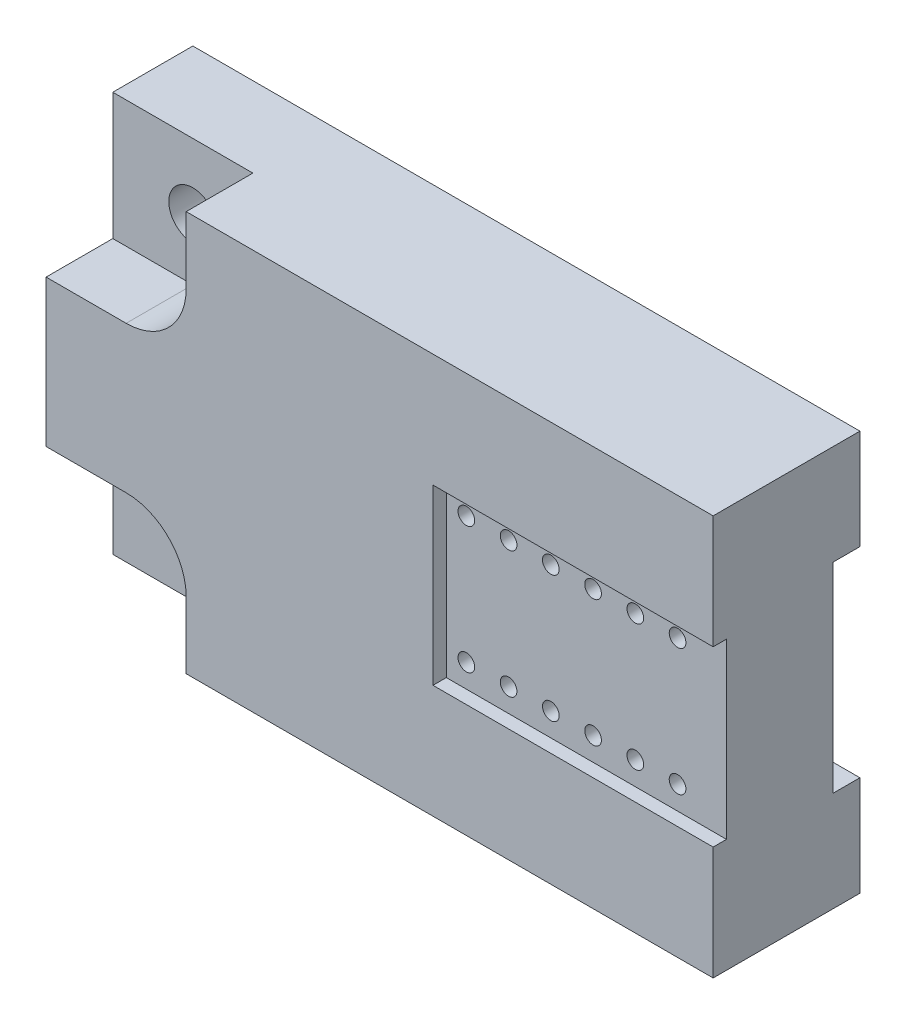
ISO-10303-21;
HEADER;
FILE_DESCRIPTION(('STEP AP214'),'2;1');
FILE_NAME('part.step','',(''),(''),'','','');
FILE_SCHEMA(('AUTOMOTIVE_DESIGN { 1 0 10303 214 1 1 1 1 }'));
ENDSEC;
DATA;
#1=APPLICATION_CONTEXT('core data for automotive mechanical design processes');
#2=APPLICATION_PROTOCOL_DEFINITION('international standard','automotive_design',2000,#1);
#3=PRODUCT_CONTEXT('',#1,'mechanical');
#4=PRODUCT('Part','Part','',(#3));
#5=PRODUCT_RELATED_PRODUCT_CATEGORY('part','',(#4));
#6=PRODUCT_DEFINITION_FORMATION('','',#4);
#7=PRODUCT_DEFINITION_CONTEXT('part definition',#1,'design');
#8=PRODUCT_DEFINITION('design','',#6,#7);
#9=PRODUCT_DEFINITION_SHAPE('','',#8);
#10=(LENGTH_UNIT() NAMED_UNIT(*) SI_UNIT(.MILLI.,.METRE.));
#11=(NAMED_UNIT(*) PLANE_ANGLE_UNIT() SI_UNIT($,.RADIAN.));
#12=(NAMED_UNIT(*) SI_UNIT($,.STERADIAN.) SOLID_ANGLE_UNIT());
#13=UNCERTAINTY_MEASURE_WITH_UNIT(LENGTH_MEASURE(1.E-05),#10,'distance_accuracy_value','');
#14=(GEOMETRIC_REPRESENTATION_CONTEXT(3) GLOBAL_UNCERTAINTY_ASSIGNED_CONTEXT((#13)) GLOBAL_UNIT_ASSIGNED_CONTEXT((#10,
#11,#12)) REPRESENTATION_CONTEXT('',''));
#15=CARTESIAN_POINT('',(0.,0.,0.));
#16=DIRECTION('',(0.,0.,1.));
#17=DIRECTION('',(1.,0.,0.));
#18=AXIS2_PLACEMENT_3D('',#15,#16,#17);
#19=CARTESIAN_POINT('',(0.,0.,12.));
#20=DIRECTION('',(0.,0.,-1.));
#21=DIRECTION('',(-1.,0.,0.));
#22=AXIS2_PLACEMENT_3D('',#19,#20,#21);
#23=PLANE('',#22);
#24=CARTESIAN_POINT('',(-88.,-9.99999999999999,12.));
#25=DIRECTION('',(0.,0.,1.));
#26=DIRECTION('',(1.,0.,0.));
#27=AXIS2_PLACEMENT_3D('',#24,#25,#26);
#28=CIRCLE('',#27,3.6);
#29=CARTESIAN_POINT('',(-84.4,-9.99999999999999,12.));
#30=VERTEX_POINT('',#29);
#31=EDGE_CURVE('E297',#30,#30,#28,.T.);
#32=ORIENTED_EDGE('',*,*,#31,.F.);
#33=EDGE_LOOP('',(#32));
#34=FACE_BOUND('',#33,.T.);
#35=DIRECTION('',(-1.,0.,0.));
#36=VECTOR('',#35,1.);
#37=CARTESIAN_POINT('',(0.,-19.,12.));
#38=LINE('',#37,#36);
#39=CARTESIAN_POINT('',(-88.,-19.,12.));
#40=VERTEX_POINT('',#39);
#41=CARTESIAN_POINT('',(-100.,-19.,12.));
#42=VERTEX_POINT('',#41);
#43=EDGE_CURVE('E269',#40,#42,#38,.T.);
#44=ORIENTED_EDGE('',*,*,#43,.F.);
#45=CARTESIAN_POINT('',(-88.,-9.99999999999999,12.));
#46=DIRECTION('',(0.,0.,1.));
#47=DIRECTION('',(1.,0.,0.));
#48=AXIS2_PLACEMENT_3D('',#45,#46,#47);
#49=CIRCLE('',#48,9.00000000000001);
#50=CARTESIAN_POINT('',(-79.,-9.99999999999999,12.));
#51=VERTEX_POINT('',#50);
#52=EDGE_CURVE('E267',#40,#51,#49,.T.);
#53=ORIENTED_EDGE('',*,*,#52,.T.);
#54=DIRECTION('',(0.,1.,0.));
#55=VECTOR('',#54,1.);
#56=CARTESIAN_POINT('',(-79.,0.,12.));
#57=LINE('',#56,#55);
#58=CARTESIAN_POINT('',(-79.,0.,12.));
#59=VERTEX_POINT('',#58);
#60=EDGE_CURVE('E265',#51,#59,#57,.T.);
#61=ORIENTED_EDGE('',*,*,#60,.T.);
#62=DIRECTION('',(-1.,0.,0.));
#63=VECTOR('',#62,1.);
#64=CARTESIAN_POINT('',(0.,0.,12.));
#65=LINE('',#64,#63);
#66=CARTESIAN_POINT('',(-100.,0.,12.));
#67=VERTEX_POINT('',#66);
#68=EDGE_CURVE('E303',#59,#67,#65,.T.);
#69=ORIENTED_EDGE('',*,*,#68,.T.);
#70=DIRECTION('',(0.,-1.,0.));
#71=VECTOR('',#70,1.);
#72=CARTESIAN_POINT('',(-100.,0.,12.));
#73=LINE('',#72,#71);
#74=EDGE_CURVE('E307',#67,#42,#73,.T.);
#75=ORIENTED_EDGE('',*,*,#74,.T.);
#76=EDGE_LOOP('',(#44,#53,#61,#69,#75));
#77=FACE_BOUND('',#76,.T.);
#78=ADVANCED_FACE('F35',(#34,#77),#23,.F.);
#79=CARTESIAN_POINT('',(0.,0.,12.));
#80=DIRECTION('',(-1.,0.,0.));
#81=DIRECTION('',(0.,-1.,0.));
#82=AXIS2_PLACEMENT_3D('',#79,#80,#81);
#83=PLANE('',#82);
#84=DIRECTION('',(0.,-1.,0.));
#85=VECTOR('',#84,1.);
#86=CARTESIAN_POINT('',(0.,-15.,4.));
#87=LINE('',#86,#85);
#88=CARTESIAN_POINT('',(0.,-15.,4.));
#89=VERTEX_POINT('',#88);
#90=CARTESIAN_POINT('',(0.,-45.,4.));
#91=VERTEX_POINT('',#90);
#92=EDGE_CURVE('E182',#89,#91,#87,.T.);
#93=ORIENTED_EDGE('',*,*,#92,.F.);
#94=DIRECTION('',(0.,0.,-1.));
#95=VECTOR('',#94,1.);
#96=CARTESIAN_POINT('',(0.,-15.,4.));
#97=LINE('',#96,#95);
#98=CARTESIAN_POINT('',(0.,-15.,0.));
#99=VERTEX_POINT('',#98);
#100=EDGE_CURVE('E219',#89,#99,#97,.T.);
#101=ORIENTED_EDGE('',*,*,#100,.T.);
#102=DIRECTION('',(0.,1.,0.));
#103=VECTOR('',#102,1.);
#104=CARTESIAN_POINT('',(0.,0.,0.));
#105=LINE('',#104,#103);
#106=CARTESIAN_POINT('',(0.,0.,0.));
#107=VERTEX_POINT('',#106);
#108=EDGE_CURVE('E314',#99,#107,#105,.T.);
#109=ORIENTED_EDGE('',*,*,#108,.T.);
#110=DIRECTION('',(0.,0.,-1.));
#111=VECTOR('',#110,1.);
#112=CARTESIAN_POINT('',(0.,0.,12.));
#113=LINE('',#112,#111);
#114=CARTESIAN_POINT('',(0.,0.,22.));
#115=VERTEX_POINT('',#114);
#116=EDGE_CURVE('E11',#115,#107,#113,.T.);
#117=ORIENTED_EDGE('',*,*,#116,.F.);
#118=DIRECTION('',(0.,1.,0.));
#119=VECTOR('',#118,1.);
#120=CARTESIAN_POINT('',(0.,0.,22.));
#121=LINE('',#120,#119);
#122=CARTESIAN_POINT('',(0.,-17.,22.));
#123=VERTEX_POINT('',#122);
#124=EDGE_CURVE('E241',#123,#115,#121,.T.);
#125=ORIENTED_EDGE('',*,*,#124,.F.);
#126=DIRECTION('',(0.,0.,1.));
#127=VECTOR('',#126,1.);
#128=CARTESIAN_POINT('',(0.,-17.,20.));
#129=LINE('',#128,#127);
#130=CARTESIAN_POINT('',(0.,-17.,20.));
#131=VERTEX_POINT('',#130);
#132=EDGE_CURVE('E60',#131,#123,#129,.T.);
#133=ORIENTED_EDGE('',*,*,#132,.F.);
#134=DIRECTION('',(0.,1.,0.));
#135=VECTOR('',#134,1.);
#136=CARTESIAN_POINT('',(0.,-17.,20.));
#137=LINE('',#136,#135);
#138=CARTESIAN_POINT('',(0.,-43.,20.));
#139=VERTEX_POINT('',#138);
#140=EDGE_CURVE('E203',#139,#131,#137,.T.);
#141=ORIENTED_EDGE('',*,*,#140,.F.);
#142=DIRECTION('',(0.,0.,1.));
#143=VECTOR('',#142,1.);
#144=CARTESIAN_POINT('',(0.,-43.,20.));
#145=LINE('',#144,#143);
#146=CARTESIAN_POINT('',(0.,-43.,22.));
#147=VERTEX_POINT('',#146);
#148=EDGE_CURVE('E223',#139,#147,#145,.T.);
#149=ORIENTED_EDGE('',*,*,#148,.T.);
#150=CARTESIAN_POINT('',(0.,-60.,22.));
#151=VERTEX_POINT('',#150);
#152=EDGE_CURVE('E242',#151,#147,#121,.T.);
#153=ORIENTED_EDGE('',*,*,#152,.F.);
#154=DIRECTION('',(0.,0.,-1.));
#155=VECTOR('',#154,1.);
#156=CARTESIAN_POINT('',(0.,-60.,12.));
#157=LINE('',#156,#155);
#158=CARTESIAN_POINT('',(0.,-60.,0.));
#159=VERTEX_POINT('',#158);
#160=EDGE_CURVE('E311',#151,#159,#157,.T.);
#161=ORIENTED_EDGE('',*,*,#160,.T.);
#162=CARTESIAN_POINT('',(0.,-45.,0.));
#163=VERTEX_POINT('',#162);
#164=EDGE_CURVE('E196',#159,#163,#105,.T.);
#165=ORIENTED_EDGE('',*,*,#164,.T.);
#166=DIRECTION('',(0.,0.,-1.));
#167=VECTOR('',#166,1.);
#168=CARTESIAN_POINT('',(0.,-45.,4.));
#169=LINE('',#168,#167);
#170=EDGE_CURVE('E52',#91,#163,#169,.T.);
#171=ORIENTED_EDGE('',*,*,#170,.F.);
#172=EDGE_LOOP('',(#93,#101,#109,#117,#125,#133,#141,#149,#153,#161,#165,#171));
#173=FACE_BOUND('',#172,.T.);
#174=ADVANCED_FACE('F37',(#173),#83,.F.);
#175=CARTESIAN_POINT('',(0.,0.,12.));
#176=DIRECTION('',(0.,-1.,0.));
#177=DIRECTION('',(1.,0.,0.));
#178=AXIS2_PLACEMENT_3D('',#175,#176,#177);
#179=PLANE('',#178);
#180=DIRECTION('',(-1.,0.,0.));
#181=VECTOR('',#180,1.);
#182=CARTESIAN_POINT('',(0.,0.,0.));
#183=LINE('',#182,#181);
#184=CARTESIAN_POINT('',(-100.,0.,0.));
#185=VERTEX_POINT('',#184);
#186=EDGE_CURVE('E313',#107,#185,#183,.T.);
#187=ORIENTED_EDGE('',*,*,#186,.T.);
#188=DIRECTION('',(0.,0.,-1.));
#189=VECTOR('',#188,1.);
#190=CARTESIAN_POINT('',(-100.,0.,12.));
#191=LINE('',#190,#189);
#192=EDGE_CURVE('E44',#67,#185,#191,.T.);
#193=ORIENTED_EDGE('',*,*,#192,.F.);
#194=ORIENTED_EDGE('',*,*,#68,.F.);
#195=DIRECTION('',(0.,0.,-1.));
#196=VECTOR('',#195,1.);
#197=CARTESIAN_POINT('',(-79.,0.,22.));
#198=LINE('',#197,#196);
#199=CARTESIAN_POINT('',(-79.,0.,22.));
#200=VERTEX_POINT('',#199);
#201=EDGE_CURVE('E287',#200,#59,#198,.T.);
#202=ORIENTED_EDGE('',*,*,#201,.F.);
#203=DIRECTION('',(-1.,0.,0.));
#204=VECTOR('',#203,1.);
#205=CARTESIAN_POINT('',(0.,0.,22.));
#206=LINE('',#205,#204);
#207=EDGE_CURVE('E245',#115,#200,#206,.T.);
#208=ORIENTED_EDGE('',*,*,#207,.F.);
#209=ORIENTED_EDGE('',*,*,#116,.T.);
#210=EDGE_LOOP('',(#187,#193,#194,#202,#208,#209));
#211=FACE_BOUND('',#210,.T.);
#212=ADVANCED_FACE('F392',(#211),#179,.F.);
#213=CARTESIAN_POINT('',(-100.,0.,12.));
#214=DIRECTION('',(1.,0.,0.));
#215=DIRECTION('',(0.,1.,0.));
#216=AXIS2_PLACEMENT_3D('',#213,#214,#215);
#217=PLANE('',#216);
#218=DIRECTION('',(0.,-1.,0.));
#219=VECTOR('',#218,1.);
#220=CARTESIAN_POINT('',(-100.,0.,0.));
#221=LINE('',#220,#219);
#222=CARTESIAN_POINT('',(-100.,-60.,0.));
#223=VERTEX_POINT('',#222);
#224=EDGE_CURVE('E316',#185,#223,#221,.T.);
#225=ORIENTED_EDGE('',*,*,#224,.T.);
#226=DIRECTION('',(0.,0.,-1.));
#227=VECTOR('',#226,1.);
#228=CARTESIAN_POINT('',(-100.,-60.,12.));
#229=LINE('',#228,#227);
#230=CARTESIAN_POINT('',(-100.,-60.,12.));
#231=VERTEX_POINT('',#230);
#232=EDGE_CURVE('E320',#231,#223,#229,.T.);
#233=ORIENTED_EDGE('',*,*,#232,.F.);
#234=CARTESIAN_POINT('',(-100.,-41.,12.));
#235=VERTEX_POINT('',#234);
#236=EDGE_CURVE('E305',#235,#231,#73,.T.);
#237=ORIENTED_EDGE('',*,*,#236,.F.);
#238=DIRECTION('',(0.,0.,-1.));
#239=VECTOR('',#238,1.);
#240=CARTESIAN_POINT('',(-100.,-41.,22.));
#241=LINE('',#240,#239);
#242=CARTESIAN_POINT('',(-100.,-41.,22.));
#243=VERTEX_POINT('',#242);
#244=EDGE_CURVE('E275',#243,#235,#241,.T.);
#245=ORIENTED_EDGE('',*,*,#244,.F.);
#246=DIRECTION('',(0.,-1.,0.));
#247=VECTOR('',#246,1.);
#248=CARTESIAN_POINT('',(-100.,0.,22.));
#249=LINE('',#248,#247);
#250=CARTESIAN_POINT('',(-100.,-19.,22.));
#251=VERTEX_POINT('',#250);
#252=EDGE_CURVE('E255',#251,#243,#249,.T.);
#253=ORIENTED_EDGE('',*,*,#252,.F.);
#254=DIRECTION('',(0.,0.,-1.));
#255=VECTOR('',#254,1.);
#256=CARTESIAN_POINT('',(-100.,-19.,22.));
#257=LINE('',#256,#255);
#258=EDGE_CURVE('E278',#251,#42,#257,.T.);
#259=ORIENTED_EDGE('',*,*,#258,.T.);
#260=ORIENTED_EDGE('',*,*,#74,.F.);
#261=ORIENTED_EDGE('',*,*,#192,.T.);
#262=EDGE_LOOP('',(#225,#233,#237,#245,#253,#259,#260,#261));
#263=FACE_BOUND('',#262,.T.);
#264=ADVANCED_FACE('F420',(#263),#217,.F.);
#265=CARTESIAN_POINT('',(0.,-60.,12.));
#266=DIRECTION('',(0.,1.,0.));
#267=DIRECTION('',(-1.,0.,0.));
#268=AXIS2_PLACEMENT_3D('',#265,#266,#267);
#269=PLANE('',#268);
#270=DIRECTION('',(1.,0.,0.));
#271=VECTOR('',#270,1.);
#272=CARTESIAN_POINT('',(0.,-60.,0.));
#273=LINE('',#272,#271);
#274=EDGE_CURVE('E306',#223,#159,#273,.T.);
#275=ORIENTED_EDGE('',*,*,#274,.T.);
#276=ORIENTED_EDGE('',*,*,#160,.F.);
#277=DIRECTION('',(1.,0.,0.));
#278=VECTOR('',#277,1.);
#279=CARTESIAN_POINT('',(0.,-60.,22.));
#280=LINE('',#279,#278);
#281=CARTESIAN_POINT('',(-79.,-60.,22.));
#282=VERTEX_POINT('',#281);
#283=EDGE_CURVE('E238',#282,#151,#280,.T.);
#284=ORIENTED_EDGE('',*,*,#283,.F.);
#285=DIRECTION('',(0.,0.,-1.));
#286=VECTOR('',#285,1.);
#287=CARTESIAN_POINT('',(-79.,-60.,22.));
#288=LINE('',#287,#286);
#289=CARTESIAN_POINT('',(-79.,-60.,12.));
#290=VERTEX_POINT('',#289);
#291=EDGE_CURVE('E290',#282,#290,#288,.T.);
#292=ORIENTED_EDGE('',*,*,#291,.T.);
#293=DIRECTION('',(1.,0.,0.));
#294=VECTOR('',#293,1.);
#295=CARTESIAN_POINT('',(0.,-60.,12.));
#296=LINE('',#295,#294);
#297=EDGE_CURVE('E309',#231,#290,#296,.T.);
#298=ORIENTED_EDGE('',*,*,#297,.F.);
#299=ORIENTED_EDGE('',*,*,#232,.T.);
#300=EDGE_LOOP('',(#275,#276,#284,#292,#298,#299));
#301=FACE_BOUND('',#300,.T.);
#302=ADVANCED_FACE('F415',(#301),#269,.F.);
#303=CARTESIAN_POINT('',(-88.,-50.,12.));
#304=DIRECTION('',(0.,0.,1.));
#305=DIRECTION('',(1.,0.,0.));
#306=AXIS2_PLACEMENT_3D('',#303,#304,#305);
#307=CIRCLE('',#306,3.6);
#308=CARTESIAN_POINT('',(-84.4,-50.,12.));
#309=VERTEX_POINT('',#308);
#310=EDGE_CURVE('E296',#309,#309,#307,.T.);
#311=ORIENTED_EDGE('',*,*,#310,.F.);
#312=EDGE_LOOP('',(#311));
#313=FACE_BOUND('',#312,.T.);
#314=CARTESIAN_POINT('',(-88.,-50.,12.));
#315=DIRECTION('',(0.,0.,1.));
#316=DIRECTION('',(1.,0.,0.));
#317=AXIS2_PLACEMENT_3D('',#314,#315,#316);
#318=CIRCLE('',#317,9.00000000000001);
#319=CARTESIAN_POINT('',(-79.,-50.,12.));
#320=VERTEX_POINT('',#319);
#321=CARTESIAN_POINT('',(-88.,-41.,12.));
#322=VERTEX_POINT('',#321);
#323=EDGE_CURVE('E226',#320,#322,#318,.T.);
#324=ORIENTED_EDGE('',*,*,#323,.T.);
#325=DIRECTION('',(-1.,0.,0.));
#326=VECTOR('',#325,1.);
#327=CARTESIAN_POINT('',(0.,-41.,12.));
#328=LINE('',#327,#326);
#329=EDGE_CURVE('E236',#322,#235,#328,.T.);
#330=ORIENTED_EDGE('',*,*,#329,.T.);
#331=ORIENTED_EDGE('',*,*,#236,.T.);
#332=ORIENTED_EDGE('',*,*,#297,.T.);
#333=DIRECTION('',(0.,-1.,0.));
#334=VECTOR('',#333,1.);
#335=CARTESIAN_POINT('',(-79.0000000000001,-1.09634523681734E-13,12.));
#336=LINE('',#335,#334);
#337=EDGE_CURVE('E262',#320,#290,#336,.T.);
#338=ORIENTED_EDGE('',*,*,#337,.F.);
#339=EDGE_LOOP('',(#324,#330,#331,#332,#338));
#340=FACE_BOUND('',#339,.T.);
#341=ADVANCED_FACE('F425',(#313,#340),#23,.F.);
#342=CARTESIAN_POINT('',(0.,0.,0.));
#343=DIRECTION('',(0.,0.,-1.));
#344=DIRECTION('',(-1.,0.,0.));
#345=AXIS2_PLACEMENT_3D('',#342,#343,#344);
#346=PLANE('',#345);
#347=DIRECTION('',(1.,0.,0.));
#348=VECTOR('',#347,1.);
#349=CARTESIAN_POINT('',(0.,-15.,0.));
#350=LINE('',#349,#348);
#351=CARTESIAN_POINT('',(-44.,-15.,0.));
#352=VERTEX_POINT('',#351);
#353=EDGE_CURVE('E191',#352,#99,#350,.T.);
#354=ORIENTED_EDGE('',*,*,#353,.F.);
#355=DIRECTION('',(0.,1.,0.));
#356=VECTOR('',#355,1.);
#357=CARTESIAN_POINT('',(-44.,-15.,0.));
#358=LINE('',#357,#356);
#359=CARTESIAN_POINT('',(-44.,-45.,0.));
#360=VERTEX_POINT('',#359);
#361=EDGE_CURVE('E368',#360,#352,#358,.T.);
#362=ORIENTED_EDGE('',*,*,#361,.F.);
#363=DIRECTION('',(-1.,0.,0.));
#364=VECTOR('',#363,1.);
#365=CARTESIAN_POINT('',(0.,-45.,0.));
#366=LINE('',#365,#364);
#367=EDGE_CURVE('E365',#163,#360,#366,.T.);
#368=ORIENTED_EDGE('',*,*,#367,.F.);
#369=ORIENTED_EDGE('',*,*,#164,.F.);
#370=ORIENTED_EDGE('',*,*,#274,.F.);
#371=ORIENTED_EDGE('',*,*,#224,.F.);
#372=ORIENTED_EDGE('',*,*,#186,.F.);
#373=ORIENTED_EDGE('',*,*,#108,.F.);
#374=EDGE_LOOP('',(#354,#362,#368,#369,#370,#371,#372,#373));
#375=FACE_BOUND('',#374,.T.);
#376=CARTESIAN_POINT('',(-88.,-9.99999999999999,0.));
#377=DIRECTION('',(0.,0.,-1.));
#378=DIRECTION('',(-1.,0.,0.));
#379=AXIS2_PLACEMENT_3D('',#376,#377,#378);
#380=CIRCLE('',#379,3.6);
#381=CARTESIAN_POINT('',(-91.6,-9.99999999999999,0.));
#382=VERTEX_POINT('',#381);
#383=EDGE_CURVE('E327',#382,#382,#380,.T.);
#384=ORIENTED_EDGE('',*,*,#383,.F.);
#385=EDGE_LOOP('',(#384));
#386=FACE_BOUND('',#385,.T.);
#387=CARTESIAN_POINT('',(-88.,-50.,0.));
#388=DIRECTION('',(0.,0.,-1.));
#389=DIRECTION('',(-1.,0.,0.));
#390=AXIS2_PLACEMENT_3D('',#387,#388,#389);
#391=CIRCLE('',#390,3.6);
#392=CARTESIAN_POINT('',(-91.6,-50.,0.));
#393=VERTEX_POINT('',#392);
#394=EDGE_CURVE('E300',#393,#393,#391,.T.);
#395=ORIENTED_EDGE('',*,*,#394,.F.);
#396=EDGE_LOOP('',(#395));
#397=FACE_BOUND('',#396,.T.);
#398=ADVANCED_FACE('F383',(#375,#386,#397),#346,.T.);
#399=CARTESIAN_POINT('',(-88.,-50.,-8.));
#400=DIRECTION('',(0.,0.,1.));
#401=DIRECTION('',(1.,0.,0.));
#402=AXIS2_PLACEMENT_3D('',#399,#400,#401);
#403=CYLINDRICAL_SURFACE('',#402,3.6);
#404=ORIENTED_EDGE('',*,*,#394,.T.);
#405=EDGE_LOOP('',(#404));
#406=FACE_BOUND('',#405,.T.);
#407=ORIENTED_EDGE('',*,*,#310,.T.);
#408=EDGE_LOOP('',(#407));
#409=FACE_BOUND('',#408,.T.);
#410=ADVANCED_FACE('F471',(#406,#409),#403,.F.);
#411=CARTESIAN_POINT('',(-88.,-9.99999999999999,-8.));
#412=DIRECTION('',(0.,0.,1.));
#413=DIRECTION('',(1.,0.,0.));
#414=AXIS2_PLACEMENT_3D('',#411,#412,#413);
#415=CYLINDRICAL_SURFACE('',#414,3.6);
#416=ORIENTED_EDGE('',*,*,#383,.T.);
#417=EDGE_LOOP('',(#416));
#418=FACE_BOUND('',#417,.T.);
#419=ORIENTED_EDGE('',*,*,#31,.T.);
#420=EDGE_LOOP('',(#419));
#421=FACE_BOUND('',#420,.T.);
#422=ADVANCED_FACE('F476',(#418,#421),#415,.F.);
#423=CARTESIAN_POINT('',(-88.,-50.,22.));
#424=DIRECTION('',(0.,0.,-1.));
#425=DIRECTION('',(-1.,0.,0.));
#426=AXIS2_PLACEMENT_3D('',#423,#424,#425);
#427=CYLINDRICAL_SURFACE('',#426,9.00000000000001);
#428=ORIENTED_EDGE('',*,*,#323,.F.);
#429=DIRECTION('',(0.,0.,-1.));
#430=VECTOR('',#429,1.);
#431=CARTESIAN_POINT('',(-79.,-50.,22.));
#432=LINE('',#431,#430);
#433=CARTESIAN_POINT('',(-79.,-50.,22.));
#434=VERTEX_POINT('',#433);
#435=EDGE_CURVE('E293',#434,#320,#432,.T.);
#436=ORIENTED_EDGE('',*,*,#435,.F.);
#437=CARTESIAN_POINT('',(-88.,-50.,22.));
#438=DIRECTION('',(0.,0.,1.));
#439=DIRECTION('',(1.,0.,0.));
#440=AXIS2_PLACEMENT_3D('',#437,#438,#439);
#441=CIRCLE('',#440,9.00000000000001);
#442=CARTESIAN_POINT('',(-88.,-41.,22.));
#443=VERTEX_POINT('',#442);
#444=EDGE_CURVE('E232',#434,#443,#441,.T.);
#445=ORIENTED_EDGE('',*,*,#444,.T.);
#446=DIRECTION('',(0.,0.,-1.));
#447=VECTOR('',#446,1.);
#448=CARTESIAN_POINT('',(-88.,-41.,22.));
#449=LINE('',#448,#447);
#450=EDGE_CURVE('E260',#443,#322,#449,.T.);
#451=ORIENTED_EDGE('',*,*,#450,.T.);
#452=EDGE_LOOP('',(#428,#436,#445,#451));
#453=FACE_BOUND('',#452,.T.);
#454=ADVANCED_FACE('F430',(#453),#427,.F.);
#455=CARTESIAN_POINT('',(-79.0000000000001,-1.09634523681734E-13,22.));
#456=DIRECTION('',(1.,0.,0.));
#457=DIRECTION('',(0.,1.,0.));
#458=AXIS2_PLACEMENT_3D('',#455,#456,#457);
#459=PLANE('',#458);
#460=ORIENTED_EDGE('',*,*,#337,.T.);
#461=ORIENTED_EDGE('',*,*,#291,.F.);
#462=DIRECTION('',(0.,-1.,0.));
#463=VECTOR('',#462,1.);
#464=CARTESIAN_POINT('',(-79.0000000000001,-1.09634523681734E-13,22.));
#465=LINE('',#464,#463);
#466=EDGE_CURVE('E235',#434,#282,#465,.T.);
#467=ORIENTED_EDGE('',*,*,#466,.F.);
#468=ORIENTED_EDGE('',*,*,#435,.T.);
#469=EDGE_LOOP('',(#460,#461,#467,#468));
#470=FACE_BOUND('',#469,.T.);
#471=ADVANCED_FACE('F427',(#470),#459,.F.);
#472=CARTESIAN_POINT('',(-79.,0.,22.));
#473=DIRECTION('',(-1.,0.,0.));
#474=DIRECTION('',(0.,0.,1.));
#475=AXIS2_PLACEMENT_3D('',#472,#473,#474);
#476=PLANE('',#475);
#477=ORIENTED_EDGE('',*,*,#60,.F.);
#478=DIRECTION('',(0.,0.,-1.));
#479=VECTOR('',#478,1.);
#480=CARTESIAN_POINT('',(-79.,-9.99999999999999,22.));
#481=LINE('',#480,#479);
#482=CARTESIAN_POINT('',(-79.,-9.99999999999999,22.));
#483=VERTEX_POINT('',#482);
#484=EDGE_CURVE('E284',#483,#51,#481,.T.);
#485=ORIENTED_EDGE('',*,*,#484,.F.);
#486=DIRECTION('',(0.,1.,0.));
#487=VECTOR('',#486,1.);
#488=CARTESIAN_POINT('',(-79.,0.,22.));
#489=LINE('',#488,#487);
#490=EDGE_CURVE('E247',#483,#200,#489,.T.);
#491=ORIENTED_EDGE('',*,*,#490,.T.);
#492=ORIENTED_EDGE('',*,*,#201,.T.);
#493=EDGE_LOOP('',(#477,#485,#491,#492));
#494=FACE_BOUND('',#493,.T.);
#495=ADVANCED_FACE('F445',(#494),#476,.T.);
#496=CARTESIAN_POINT('',(-88.,-9.99999999999999,22.));
#497=DIRECTION('',(0.,0.,-1.));
#498=DIRECTION('',(-1.,0.,0.));
#499=AXIS2_PLACEMENT_3D('',#496,#497,#498);
#500=CYLINDRICAL_SURFACE('',#499,9.00000000000001);
#501=ORIENTED_EDGE('',*,*,#52,.F.);
#502=DIRECTION('',(0.,0.,-1.));
#503=VECTOR('',#502,1.);
#504=CARTESIAN_POINT('',(-88.,-19.,22.));
#505=LINE('',#504,#503);
#506=CARTESIAN_POINT('',(-88.,-19.,22.));
#507=VERTEX_POINT('',#506);
#508=EDGE_CURVE('E281',#507,#40,#505,.T.);
#509=ORIENTED_EDGE('',*,*,#508,.F.);
#510=CARTESIAN_POINT('',(-88.,-9.99999999999999,22.));
#511=DIRECTION('',(0.,0.,1.));
#512=DIRECTION('',(1.,0.,0.));
#513=AXIS2_PLACEMENT_3D('',#510,#511,#512);
#514=CIRCLE('',#513,9.00000000000001);
#515=EDGE_CURVE('E250',#507,#483,#514,.T.);
#516=ORIENTED_EDGE('',*,*,#515,.T.);
#517=ORIENTED_EDGE('',*,*,#484,.T.);
#518=EDGE_LOOP('',(#501,#509,#516,#517));
#519=FACE_BOUND('',#518,.T.);
#520=ADVANCED_FACE('F447',(#519),#500,.F.);
#521=CARTESIAN_POINT('',(0.,-19.,22.));
#522=DIRECTION('',(0.,-1.,0.));
#523=DIRECTION('',(1.,0.,0.));
#524=AXIS2_PLACEMENT_3D('',#521,#522,#523);
#525=PLANE('',#524);
#526=ORIENTED_EDGE('',*,*,#43,.T.);
#527=ORIENTED_EDGE('',*,*,#258,.F.);
#528=DIRECTION('',(-1.,0.,0.));
#529=VECTOR('',#528,1.);
#530=CARTESIAN_POINT('',(0.,-19.,22.));
#531=LINE('',#530,#529);
#532=EDGE_CURVE('E253',#507,#251,#531,.T.);
#533=ORIENTED_EDGE('',*,*,#532,.F.);
#534=ORIENTED_EDGE('',*,*,#508,.T.);
#535=EDGE_LOOP('',(#526,#527,#533,#534));
#536=FACE_BOUND('',#535,.T.);
#537=ADVANCED_FACE('F440',(#536),#525,.F.);
#538=CARTESIAN_POINT('',(0.,-41.,22.));
#539=DIRECTION('',(0.,-1.,0.));
#540=DIRECTION('',(1.,0.,0.));
#541=AXIS2_PLACEMENT_3D('',#538,#539,#540);
#542=PLANE('',#541);
#543=ORIENTED_EDGE('',*,*,#329,.F.);
#544=ORIENTED_EDGE('',*,*,#450,.F.);
#545=DIRECTION('',(-1.,0.,0.));
#546=VECTOR('',#545,1.);
#547=CARTESIAN_POINT('',(0.,-41.,22.));
#548=LINE('',#547,#546);
#549=EDGE_CURVE('E257',#443,#243,#548,.T.);
#550=ORIENTED_EDGE('',*,*,#549,.T.);
#551=ORIENTED_EDGE('',*,*,#244,.T.);
#552=EDGE_LOOP('',(#543,#544,#550,#551));
#553=FACE_BOUND('',#552,.T.);
#554=ADVANCED_FACE('F435',(#553),#542,.T.);
#555=CARTESIAN_POINT('',(0.,0.,22.));
#556=DIRECTION('',(0.,0.,1.));
#557=DIRECTION('',(1.,0.,0.));
#558=AXIS2_PLACEMENT_3D('',#555,#556,#557);
#559=PLANE('',#558);
#560=DIRECTION('',(1.,0.,0.));
#561=VECTOR('',#560,1.);
#562=CARTESIAN_POINT('',(0.,-43.,22.));
#563=LINE('',#562,#561);
#564=CARTESIAN_POINT('',(-42.,-43.,22.));
#565=VERTEX_POINT('',#564);
#566=EDGE_CURVE('E207',#565,#147,#563,.T.);
#567=ORIENTED_EDGE('',*,*,#566,.F.);
#568=DIRECTION('',(0.,-1.,0.));
#569=VECTOR('',#568,1.);
#570=CARTESIAN_POINT('',(-42.,-17.,22.));
#571=LINE('',#570,#569);
#572=CARTESIAN_POINT('',(-42.,-17.,22.));
#573=VERTEX_POINT('',#572);
#574=EDGE_CURVE('E218',#573,#565,#571,.T.);
#575=ORIENTED_EDGE('',*,*,#574,.F.);
#576=DIRECTION('',(-1.,0.,0.));
#577=VECTOR('',#576,1.);
#578=CARTESIAN_POINT('',(0.,-17.,22.));
#579=LINE('',#578,#577);
#580=EDGE_CURVE('E216',#123,#573,#579,.T.);
#581=ORIENTED_EDGE('',*,*,#580,.F.);
#582=ORIENTED_EDGE('',*,*,#124,.T.);
#583=ORIENTED_EDGE('',*,*,#207,.T.);
#584=ORIENTED_EDGE('',*,*,#490,.F.);
#585=ORIENTED_EDGE('',*,*,#515,.F.);
#586=ORIENTED_EDGE('',*,*,#532,.T.);
#587=ORIENTED_EDGE('',*,*,#252,.T.);
#588=ORIENTED_EDGE('',*,*,#549,.F.);
#589=ORIENTED_EDGE('',*,*,#444,.F.);
#590=ORIENTED_EDGE('',*,*,#466,.T.);
#591=ORIENTED_EDGE('',*,*,#283,.T.);
#592=ORIENTED_EDGE('',*,*,#152,.T.);
#593=EDGE_LOOP('',(#567,#575,#581,#582,#583,#584,#585,#586,#587,#588,#589,#590,#591,#592));
#594=FACE_BOUND('',#593,.T.);
#595=ADVANCED_FACE('F397',(#594),#559,.T.);
#596=CARTESIAN_POINT('',(0.,-43.,20.));
#597=DIRECTION('',(0.,-1.,0.));
#598=DIRECTION('',(1.,0.,0.));
#599=AXIS2_PLACEMENT_3D('',#596,#597,#598);
#600=PLANE('',#599);
#601=ORIENTED_EDGE('',*,*,#566,.T.);
#602=ORIENTED_EDGE('',*,*,#148,.F.);
#603=DIRECTION('',(1.,0.,0.));
#604=VECTOR('',#603,1.);
#605=CARTESIAN_POINT('',(0.,-43.,20.));
#606=LINE('',#605,#604);
#607=CARTESIAN_POINT('',(-42.,-43.,20.));
#608=VERTEX_POINT('',#607);
#609=EDGE_CURVE('E213',#608,#139,#606,.T.);
#610=ORIENTED_EDGE('',*,*,#609,.F.);
#611=DIRECTION('',(0.,0.,1.));
#612=VECTOR('',#611,1.);
#613=CARTESIAN_POINT('',(-42.,-43.,20.));
#614=LINE('',#613,#612);
#615=EDGE_CURVE('E227',#608,#565,#614,.T.);
#616=ORIENTED_EDGE('',*,*,#615,.T.);
#617=EDGE_LOOP('',(#601,#602,#610,#616));
#618=FACE_BOUND('',#617,.T.);
#619=ADVANCED_FACE('F522',(#618),#600,.F.);
#620=CARTESIAN_POINT('',(-42.,-17.,20.));
#621=DIRECTION('',(-1.,0.,0.));
#622=DIRECTION('',(0.,0.,1.));
#623=AXIS2_PLACEMENT_3D('',#620,#621,#622);
#624=PLANE('',#623);
#625=ORIENTED_EDGE('',*,*,#574,.T.);
#626=ORIENTED_EDGE('',*,*,#615,.F.);
#627=DIRECTION('',(0.,-1.,0.));
#628=VECTOR('',#627,1.);
#629=CARTESIAN_POINT('',(-42.,-17.,20.));
#630=LINE('',#629,#628);
#631=CARTESIAN_POINT('',(-42.,-17.,20.));
#632=VERTEX_POINT('',#631);
#633=EDGE_CURVE('E210',#632,#608,#630,.T.);
#634=ORIENTED_EDGE('',*,*,#633,.F.);
#635=DIRECTION('',(0.,0.,1.));
#636=VECTOR('',#635,1.);
#637=CARTESIAN_POINT('',(-42.,-17.,20.));
#638=LINE('',#637,#636);
#639=EDGE_CURVE('E229',#632,#573,#638,.T.);
#640=ORIENTED_EDGE('',*,*,#639,.T.);
#641=EDGE_LOOP('',(#625,#626,#634,#640));
#642=FACE_BOUND('',#641,.T.);
#643=ADVANCED_FACE('F403',(#642),#624,.F.);
#644=CARTESIAN_POINT('',(0.,-17.,20.));
#645=DIRECTION('',(0.,1.,0.));
#646=DIRECTION('',(-1.,0.,0.));
#647=AXIS2_PLACEMENT_3D('',#644,#645,#646);
#648=PLANE('',#647);
#649=ORIENTED_EDGE('',*,*,#580,.T.);
#650=ORIENTED_EDGE('',*,*,#639,.F.);
#651=DIRECTION('',(-1.,0.,0.));
#652=VECTOR('',#651,1.);
#653=CARTESIAN_POINT('',(0.,-17.,20.));
#654=LINE('',#653,#652);
#655=EDGE_CURVE('E206',#131,#632,#654,.T.);
#656=ORIENTED_EDGE('',*,*,#655,.F.);
#657=ORIENTED_EDGE('',*,*,#132,.T.);
#658=EDGE_LOOP('',(#649,#650,#656,#657));
#659=FACE_BOUND('',#658,.T.);
#660=ADVANCED_FACE('F400',(#659),#648,.F.);
#661=CARTESIAN_POINT('',(0.,0.,20.));
#662=DIRECTION('',(0.,0.,-1.));
#663=DIRECTION('',(-1.,0.,0.));
#664=AXIS2_PLACEMENT_3D('',#661,#662,#663);
#665=PLANE('',#664);
#666=CARTESIAN_POINT('',(-26.334,-39.5,20.));
#667=DIRECTION('',(0.,0.,1.));
#668=DIRECTION('',(1.,0.,0.));
#669=AXIS2_PLACEMENT_3D('',#666,#667,#668);
#670=CIRCLE('',#669,1.25);
#671=CARTESIAN_POINT('',(-25.084,-39.5,20.));
#672=VERTEX_POINT('',#671);
#673=EDGE_CURVE('E731',#672,#672,#670,.T.);
#674=ORIENTED_EDGE('',*,*,#673,.F.);
#675=EDGE_LOOP('',(#674));
#676=FACE_BOUND('',#675,.T.);
#677=CARTESIAN_POINT('',(-20.001,-20.5,20.));
#678=DIRECTION('',(0.,0.,1.));
#679=DIRECTION('',(1.,0.,0.));
#680=AXIS2_PLACEMENT_3D('',#677,#678,#679);
#681=CIRCLE('',#680,1.25);
#682=CARTESIAN_POINT('',(-18.751,-20.5,20.));
#683=VERTEX_POINT('',#682);
#684=EDGE_CURVE('E733',#683,#683,#681,.T.);
#685=ORIENTED_EDGE('',*,*,#684,.F.);
#686=EDGE_LOOP('',(#685));
#687=FACE_BOUND('',#686,.T.);
#688=CARTESIAN_POINT('',(-20.001,-39.5,20.));
#689=DIRECTION('',(0.,0.,1.));
#690=DIRECTION('',(1.,0.,0.));
#691=AXIS2_PLACEMENT_3D('',#688,#689,#690);
#692=CIRCLE('',#691,1.25);
#693=CARTESIAN_POINT('',(-18.751,-39.5,20.));
#694=VERTEX_POINT('',#693);
#695=EDGE_CURVE('E739',#694,#694,#692,.T.);
#696=ORIENTED_EDGE('',*,*,#695,.F.);
#697=EDGE_LOOP('',(#696));
#698=FACE_BOUND('',#697,.T.);
#699=CARTESIAN_POINT('',(-13.668,-20.5,20.));
#700=DIRECTION('',(0.,0.,1.));
#701=DIRECTION('',(1.,0.,0.));
#702=AXIS2_PLACEMENT_3D('',#699,#700,#701);
#703=CIRCLE('',#702,1.25);
#704=CARTESIAN_POINT('',(-12.418,-20.5,20.));
#705=VERTEX_POINT('',#704);
#706=EDGE_CURVE('E742',#705,#705,#703,.T.);
#707=ORIENTED_EDGE('',*,*,#706,.F.);
#708=EDGE_LOOP('',(#707));
#709=FACE_BOUND('',#708,.T.);
#710=CARTESIAN_POINT('',(-39.,-39.5,20.));
#711=DIRECTION('',(0.,0.,1.));
#712=DIRECTION('',(1.,0.,0.));
#713=AXIS2_PLACEMENT_3D('',#710,#711,#712);
#714=CIRCLE('',#713,1.25);
#715=CARTESIAN_POINT('',(-37.75,-39.5,20.));
#716=VERTEX_POINT('',#715);
#717=EDGE_CURVE('E748',#716,#716,#714,.T.);
#718=ORIENTED_EDGE('',*,*,#717,.F.);
#719=EDGE_LOOP('',(#718));
#720=FACE_BOUND('',#719,.T.);
#721=CARTESIAN_POINT('',(-32.667,-20.5,20.));
#722=DIRECTION('',(0.,0.,1.));
#723=DIRECTION('',(1.,0.,0.));
#724=AXIS2_PLACEMENT_3D('',#721,#722,#723);
#725=CIRCLE('',#724,1.25);
#726=CARTESIAN_POINT('',(-31.417,-20.5,20.));
#727=VERTEX_POINT('',#726);
#728=EDGE_CURVE('E746',#727,#727,#725,.T.);
#729=ORIENTED_EDGE('',*,*,#728,.F.);
#730=EDGE_LOOP('',(#729));
#731=FACE_BOUND('',#730,.T.);
#732=CARTESIAN_POINT('',(-32.667,-39.5,20.));
#733=DIRECTION('',(0.,0.,1.));
#734=DIRECTION('',(1.,0.,0.));
#735=AXIS2_PLACEMENT_3D('',#732,#733,#734);
#736=CIRCLE('',#735,1.25);
#737=CARTESIAN_POINT('',(-31.417,-39.5,20.));
#738=VERTEX_POINT('',#737);
#739=EDGE_CURVE('E736',#738,#738,#736,.T.);
#740=ORIENTED_EDGE('',*,*,#739,.F.);
#741=EDGE_LOOP('',(#740));
#742=FACE_BOUND('',#741,.T.);
#743=CARTESIAN_POINT('',(-26.334,-20.5,20.));
#744=DIRECTION('',(0.,0.,1.));
#745=DIRECTION('',(1.,0.,0.));
#746=AXIS2_PLACEMENT_3D('',#743,#744,#745);
#747=CIRCLE('',#746,1.25);
#748=CARTESIAN_POINT('',(-25.084,-20.5,20.));
#749=VERTEX_POINT('',#748);
#750=EDGE_CURVE('E732',#749,#749,#747,.T.);
#751=ORIENTED_EDGE('',*,*,#750,.F.);
#752=EDGE_LOOP('',(#751));
#753=FACE_BOUND('',#752,.T.);
#754=CARTESIAN_POINT('',(-7.335,-39.5,20.));
#755=DIRECTION('',(0.,0.,1.));
#756=DIRECTION('',(1.,0.,0.));
#757=AXIS2_PLACEMENT_3D('',#754,#755,#756);
#758=CIRCLE('',#757,1.25);
#759=CARTESIAN_POINT('',(-6.085,-39.5,20.));
#760=VERTEX_POINT('',#759);
#761=EDGE_CURVE('E768',#760,#760,#758,.T.);
#762=ORIENTED_EDGE('',*,*,#761,.F.);
#763=EDGE_LOOP('',(#762));
#764=FACE_BOUND('',#763,.T.);
#765=CARTESIAN_POINT('',(-7.335,-20.5,20.));
#766=DIRECTION('',(0.,0.,1.));
#767=DIRECTION('',(1.,0.,0.));
#768=AXIS2_PLACEMENT_3D('',#765,#766,#767);
#769=CIRCLE('',#768,1.25);
#770=CARTESIAN_POINT('',(-6.085,-20.5,20.));
#771=VERTEX_POINT('',#770);
#772=EDGE_CURVE('E772',#771,#771,#769,.T.);
#773=ORIENTED_EDGE('',*,*,#772,.F.);
#774=EDGE_LOOP('',(#773));
#775=FACE_BOUND('',#774,.T.);
#776=CARTESIAN_POINT('',(-13.668,-39.5,20.));
#777=DIRECTION('',(0.,0.,1.));
#778=DIRECTION('',(1.,0.,0.));
#779=AXIS2_PLACEMENT_3D('',#776,#777,#778);
#780=CIRCLE('',#779,1.25);
#781=CARTESIAN_POINT('',(-12.418,-39.5,20.));
#782=VERTEX_POINT('',#781);
#783=EDGE_CURVE('E775',#782,#782,#780,.T.);
#784=ORIENTED_EDGE('',*,*,#783,.F.);
#785=EDGE_LOOP('',(#784));
#786=FACE_BOUND('',#785,.T.);
#787=CARTESIAN_POINT('',(-39.,-20.5,20.));
#788=DIRECTION('',(0.,0.,1.));
#789=DIRECTION('',(1.,0.,0.));
#790=AXIS2_PLACEMENT_3D('',#787,#788,#789);
#791=CIRCLE('',#790,1.25);
#792=CARTESIAN_POINT('',(-37.75,-20.5,20.));
#793=VERTEX_POINT('',#792);
#794=EDGE_CURVE('E334',#793,#793,#791,.T.);
#795=ORIENTED_EDGE('',*,*,#794,.F.);
#796=EDGE_LOOP('',(#795));
#797=FACE_BOUND('',#796,.T.);
#798=ORIENTED_EDGE('',*,*,#140,.T.);
#799=ORIENTED_EDGE('',*,*,#655,.T.);
#800=ORIENTED_EDGE('',*,*,#633,.T.);
#801=ORIENTED_EDGE('',*,*,#609,.T.);
#802=EDGE_LOOP('',(#798,#799,#800,#801));
#803=FACE_BOUND('',#802,.T.);
#804=ADVANCED_FACE('F406',(#676,#687,#698,#709,#720,#731,#742,#753,#764,#775,#786,#797,#803),
#665,.F.);
#805=CARTESIAN_POINT('',(0.,-15.,4.));
#806=DIRECTION('',(0.,1.,0.));
#807=DIRECTION('',(-1.,0.,0.));
#808=AXIS2_PLACEMENT_3D('',#805,#806,#807);
#809=PLANE('',#808);
#810=ORIENTED_EDGE('',*,*,#353,.T.);
#811=ORIENTED_EDGE('',*,*,#100,.F.);
#812=DIRECTION('',(1.,0.,0.));
#813=VECTOR('',#812,1.);
#814=CARTESIAN_POINT('',(0.,-15.,4.));
#815=LINE('',#814,#813);
#816=CARTESIAN_POINT('',(-44.,-15.,4.));
#817=VERTEX_POINT('',#816);
#818=EDGE_CURVE('E188',#817,#89,#815,.T.);
#819=ORIENTED_EDGE('',*,*,#818,.F.);
#820=DIRECTION('',(0.,0.,-1.));
#821=VECTOR('',#820,1.);
#822=CARTESIAN_POINT('',(-44.,-15.,4.));
#823=LINE('',#822,#821);
#824=EDGE_CURVE('E198',#817,#352,#823,.T.);
#825=ORIENTED_EDGE('',*,*,#824,.T.);
#826=EDGE_LOOP('',(#810,#811,#819,#825));
#827=FACE_BOUND('',#826,.T.);
#828=ADVANCED_FACE('F377',(#827),#809,.F.);
#829=CARTESIAN_POINT('',(-44.,-15.,4.));
#830=DIRECTION('',(-1.,0.,0.));
#831=DIRECTION('',(0.,0.,1.));
#832=AXIS2_PLACEMENT_3D('',#829,#830,#831);
#833=PLANE('',#832);
#834=ORIENTED_EDGE('',*,*,#361,.T.);
#835=ORIENTED_EDGE('',*,*,#824,.F.);
#836=DIRECTION('',(0.,1.,0.));
#837=VECTOR('',#836,1.);
#838=CARTESIAN_POINT('',(-44.,-15.,4.));
#839=LINE('',#838,#837);
#840=CARTESIAN_POINT('',(-44.,-45.,4.));
#841=VERTEX_POINT('',#840);
#842=EDGE_CURVE('E181',#841,#817,#839,.T.);
#843=ORIENTED_EDGE('',*,*,#842,.F.);
#844=DIRECTION('',(0.,0.,-1.));
#845=VECTOR('',#844,1.);
#846=CARTESIAN_POINT('',(-44.,-45.,4.));
#847=LINE('',#846,#845);
#848=EDGE_CURVE('E177',#841,#360,#847,.T.);
#849=ORIENTED_EDGE('',*,*,#848,.T.);
#850=EDGE_LOOP('',(#834,#835,#843,#849));
#851=FACE_BOUND('',#850,.T.);
#852=ADVANCED_FACE('F380',(#851),#833,.F.);
#853=CARTESIAN_POINT('',(0.,-45.,4.));
#854=DIRECTION('',(0.,-1.,0.));
#855=DIRECTION('',(0.,0.,-1.));
#856=AXIS2_PLACEMENT_3D('',#853,#854,#855);
#857=PLANE('',#856);
#858=ORIENTED_EDGE('',*,*,#367,.T.);
#859=ORIENTED_EDGE('',*,*,#848,.F.);
#860=DIRECTION('',(-1.,0.,0.));
#861=VECTOR('',#860,1.);
#862=CARTESIAN_POINT('',(0.,-45.,4.));
#863=LINE('',#862,#861);
#864=EDGE_CURVE('E174',#91,#841,#863,.T.);
#865=ORIENTED_EDGE('',*,*,#864,.F.);
#866=ORIENTED_EDGE('',*,*,#170,.T.);
#867=EDGE_LOOP('',(#858,#859,#865,#866));
#868=FACE_BOUND('',#867,.T.);
#869=ADVANCED_FACE('F176',(#868),#857,.F.);
#870=CARTESIAN_POINT('',(0.,0.,4.));
#871=DIRECTION('',(0.,0.,-1.));
#872=DIRECTION('',(-1.,0.,0.));
#873=AXIS2_PLACEMENT_3D('',#870,#871,#872);
#874=PLANE('',#873);
#875=CARTESIAN_POINT('',(-26.334,-39.5,4.));
#876=DIRECTION('',(0.,0.,-1.));
#877=DIRECTION('',(-1.,0.,0.));
#878=AXIS2_PLACEMENT_3D('',#875,#876,#877);
#879=CIRCLE('',#878,1.25);
#880=CARTESIAN_POINT('',(-27.584,-39.5,4.));
#881=VERTEX_POINT('',#880);
#882=EDGE_CURVE('E39',#881,#881,#879,.T.);
#883=ORIENTED_EDGE('',*,*,#882,.F.);
#884=EDGE_LOOP('',(#883));
#885=FACE_BOUND('',#884,.T.);
#886=CARTESIAN_POINT('',(-20.001,-20.5,4.));
#887=DIRECTION('',(0.,0.,-1.));
#888=DIRECTION('',(-1.,0.,0.));
#889=AXIS2_PLACEMENT_3D('',#886,#887,#888);
#890=CIRCLE('',#889,1.25);
#891=CARTESIAN_POINT('',(-21.251,-20.5,4.));
#892=VERTEX_POINT('',#891);
#893=EDGE_CURVE('E360',#892,#892,#890,.T.);
#894=ORIENTED_EDGE('',*,*,#893,.F.);
#895=EDGE_LOOP('',(#894));
#896=FACE_BOUND('',#895,.T.);
#897=CARTESIAN_POINT('',(-20.001,-39.5,4.));
#898=DIRECTION('',(0.,0.,-1.));
#899=DIRECTION('',(-1.,0.,0.));
#900=AXIS2_PLACEMENT_3D('',#897,#898,#899);
#901=CIRCLE('',#900,1.25);
#902=CARTESIAN_POINT('',(-21.251,-39.5,4.));
#903=VERTEX_POINT('',#902);
#904=EDGE_CURVE('E358',#903,#903,#901,.T.);
#905=ORIENTED_EDGE('',*,*,#904,.F.);
#906=EDGE_LOOP('',(#905));
#907=FACE_BOUND('',#906,.T.);
#908=CARTESIAN_POINT('',(-13.668,-20.5,4.));
#909=DIRECTION('',(0.,0.,-1.));
#910=DIRECTION('',(-1.,0.,0.));
#911=AXIS2_PLACEMENT_3D('',#908,#909,#910);
#912=CIRCLE('',#911,1.25);
#913=CARTESIAN_POINT('',(-14.918,-20.5,4.));
#914=VERTEX_POINT('',#913);
#915=EDGE_CURVE('E355',#914,#914,#912,.T.);
#916=ORIENTED_EDGE('',*,*,#915,.F.);
#917=EDGE_LOOP('',(#916));
#918=FACE_BOUND('',#917,.T.);
#919=CARTESIAN_POINT('',(-39.,-39.5,4.));
#920=DIRECTION('',(0.,0.,-1.));
#921=DIRECTION('',(-1.,0.,0.));
#922=AXIS2_PLACEMENT_3D('',#919,#920,#921);
#923=CIRCLE('',#922,1.25);
#924=CARTESIAN_POINT('',(-40.25,-39.5,4.));
#925=VERTEX_POINT('',#924);
#926=EDGE_CURVE('E352',#925,#925,#923,.T.);
#927=ORIENTED_EDGE('',*,*,#926,.F.);
#928=EDGE_LOOP('',(#927));
#929=FACE_BOUND('',#928,.T.);
#930=CARTESIAN_POINT('',(-32.667,-20.5,4.));
#931=DIRECTION('',(0.,0.,-1.));
#932=DIRECTION('',(-1.,0.,0.));
#933=AXIS2_PLACEMENT_3D('',#930,#931,#932);
#934=CIRCLE('',#933,1.25);
#935=CARTESIAN_POINT('',(-33.917,-20.5,4.));
#936=VERTEX_POINT('',#935);
#937=EDGE_CURVE('E349',#936,#936,#934,.T.);
#938=ORIENTED_EDGE('',*,*,#937,.F.);
#939=EDGE_LOOP('',(#938));
#940=FACE_BOUND('',#939,.T.);
#941=CARTESIAN_POINT('',(-32.667,-39.5,4.));
#942=DIRECTION('',(0.,0.,-1.));
#943=DIRECTION('',(-1.,0.,0.));
#944=AXIS2_PLACEMENT_3D('',#941,#942,#943);
#945=CIRCLE('',#944,1.25);
#946=CARTESIAN_POINT('',(-33.917,-39.5,4.));
#947=VERTEX_POINT('',#946);
#948=EDGE_CURVE('E346',#947,#947,#945,.T.);
#949=ORIENTED_EDGE('',*,*,#948,.F.);
#950=EDGE_LOOP('',(#949));
#951=FACE_BOUND('',#950,.T.);
#952=CARTESIAN_POINT('',(-26.334,-20.5,4.));
#953=DIRECTION('',(0.,0.,-1.));
#954=DIRECTION('',(-1.,0.,0.));
#955=AXIS2_PLACEMENT_3D('',#952,#953,#954);
#956=CIRCLE('',#955,1.25);
#957=CARTESIAN_POINT('',(-27.584,-20.5,4.));
#958=VERTEX_POINT('',#957);
#959=EDGE_CURVE('E343',#958,#958,#956,.T.);
#960=ORIENTED_EDGE('',*,*,#959,.F.);
#961=EDGE_LOOP('',(#960));
#962=FACE_BOUND('',#961,.T.);
#963=CARTESIAN_POINT('',(-7.335,-39.5,4.));
#964=DIRECTION('',(0.,0.,-1.));
#965=DIRECTION('',(-1.,0.,0.));
#966=AXIS2_PLACEMENT_3D('',#963,#964,#965);
#967=CIRCLE('',#966,1.25);
#968=CARTESIAN_POINT('',(-8.58500000000001,-39.5,4.));
#969=VERTEX_POINT('',#968);
#970=EDGE_CURVE('E340',#969,#969,#967,.T.);
#971=ORIENTED_EDGE('',*,*,#970,.F.);
#972=EDGE_LOOP('',(#971));
#973=FACE_BOUND('',#972,.T.);
#974=CARTESIAN_POINT('',(-7.335,-20.5,4.));
#975=DIRECTION('',(0.,0.,-1.));
#976=DIRECTION('',(-1.,0.,0.));
#977=AXIS2_PLACEMENT_3D('',#974,#975,#976);
#978=CIRCLE('',#977,1.25);
#979=CARTESIAN_POINT('',(-8.58500000000001,-20.5,4.));
#980=VERTEX_POINT('',#979);
#981=EDGE_CURVE('E337',#980,#980,#978,.T.);
#982=ORIENTED_EDGE('',*,*,#981,.F.);
#983=EDGE_LOOP('',(#982));
#984=FACE_BOUND('',#983,.T.);
#985=CARTESIAN_POINT('',(-13.668,-39.5,4.));
#986=DIRECTION('',(0.,0.,-1.));
#987=DIRECTION('',(-1.,0.,0.));
#988=AXIS2_PLACEMENT_3D('',#985,#986,#987);
#989=CIRCLE('',#988,1.25);
#990=CARTESIAN_POINT('',(-14.918,-39.5,4.));
#991=VERTEX_POINT('',#990);
#992=EDGE_CURVE('E333',#991,#991,#989,.T.);
#993=ORIENTED_EDGE('',*,*,#992,.F.);
#994=EDGE_LOOP('',(#993));
#995=FACE_BOUND('',#994,.T.);
#996=CARTESIAN_POINT('',(-39.,-20.5,4.));
#997=DIRECTION('',(0.,0.,-1.));
#998=DIRECTION('',(-1.,0.,0.));
#999=AXIS2_PLACEMENT_3D('',#996,#997,#998);
#1000=CIRCLE('',#999,1.25);
#1001=CARTESIAN_POINT('',(-40.25,-20.5,4.));
#1002=VERTEX_POINT('',#1001);
#1003=EDGE_CURVE('E330',#1002,#1002,#1000,.T.);
#1004=ORIENTED_EDGE('',*,*,#1003,.F.);
#1005=EDGE_LOOP('',(#1004));
#1006=FACE_BOUND('',#1005,.T.);
#1007=ORIENTED_EDGE('',*,*,#92,.T.);
#1008=ORIENTED_EDGE('',*,*,#864,.T.);
#1009=ORIENTED_EDGE('',*,*,#842,.T.);
#1010=ORIENTED_EDGE('',*,*,#818,.T.);
#1011=EDGE_LOOP('',(#1007,#1008,#1009,#1010));
#1012=FACE_BOUND('',#1011,.T.);
#1013=ADVANCED_FACE('F186',(#885,#896,#907,#918,#929,#940,#951,#962,#973,#984,#995,#1006,#1012),
#874,.T.);
#1014=CARTESIAN_POINT('',(-39.,-20.5,0.));
#1015=DIRECTION('',(0.,0.,1.));
#1016=DIRECTION('',(1.,0.,0.));
#1017=AXIS2_PLACEMENT_3D('',#1014,#1015,#1016);
#1018=CYLINDRICAL_SURFACE('',#1017,1.25);
#1019=ORIENTED_EDGE('',*,*,#1003,.T.);
#1020=EDGE_LOOP('',(#1019));
#1021=FACE_BOUND('',#1020,.T.);
#1022=ORIENTED_EDGE('',*,*,#794,.T.);
#1023=EDGE_LOOP('',(#1022));
#1024=FACE_BOUND('',#1023,.T.);
#1025=ADVANCED_FACE('F606',(#1021,#1024),#1018,.F.);
#1026=CARTESIAN_POINT('',(-13.668,-39.5,0.));
#1027=DIRECTION('',(0.,0.,1.));
#1028=DIRECTION('',(1.,0.,0.));
#1029=AXIS2_PLACEMENT_3D('',#1026,#1027,#1028);
#1030=CYLINDRICAL_SURFACE('',#1029,1.25);
#1031=ORIENTED_EDGE('',*,*,#992,.T.);
#1032=EDGE_LOOP('',(#1031));
#1033=FACE_BOUND('',#1032,.T.);
#1034=ORIENTED_EDGE('',*,*,#783,.T.);
#1035=EDGE_LOOP('',(#1034));
#1036=FACE_BOUND('',#1035,.T.);
#1037=ADVANCED_FACE('F616',(#1033,#1036),#1030,.F.);
#1038=CARTESIAN_POINT('',(-7.335,-20.5,0.));
#1039=DIRECTION('',(0.,0.,1.));
#1040=DIRECTION('',(1.,0.,0.));
#1041=AXIS2_PLACEMENT_3D('',#1038,#1039,#1040);
#1042=CYLINDRICAL_SURFACE('',#1041,1.25);
#1043=ORIENTED_EDGE('',*,*,#981,.T.);
#1044=EDGE_LOOP('',(#1043));
#1045=FACE_BOUND('',#1044,.T.);
#1046=ORIENTED_EDGE('',*,*,#772,.T.);
#1047=EDGE_LOOP('',(#1046));
#1048=FACE_BOUND('',#1047,.T.);
#1049=ADVANCED_FACE('F626',(#1045,#1048),#1042,.F.);
#1050=CARTESIAN_POINT('',(-7.335,-39.5,0.));
#1051=DIRECTION('',(0.,0.,1.));
#1052=DIRECTION('',(1.,0.,0.));
#1053=AXIS2_PLACEMENT_3D('',#1050,#1051,#1052);
#1054=CYLINDRICAL_SURFACE('',#1053,1.25);
#1055=ORIENTED_EDGE('',*,*,#970,.T.);
#1056=EDGE_LOOP('',(#1055));
#1057=FACE_BOUND('',#1056,.T.);
#1058=ORIENTED_EDGE('',*,*,#761,.T.);
#1059=EDGE_LOOP('',(#1058));
#1060=FACE_BOUND('',#1059,.T.);
#1061=ADVANCED_FACE('F636',(#1057,#1060),#1054,.F.);
#1062=CARTESIAN_POINT('',(-26.334,-20.5,0.));
#1063=DIRECTION('',(0.,0.,1.));
#1064=DIRECTION('',(1.,0.,0.));
#1065=AXIS2_PLACEMENT_3D('',#1062,#1063,#1064);
#1066=CYLINDRICAL_SURFACE('',#1065,1.25);
#1067=ORIENTED_EDGE('',*,*,#959,.T.);
#1068=EDGE_LOOP('',(#1067));
#1069=FACE_BOUND('',#1068,.T.);
#1070=ORIENTED_EDGE('',*,*,#750,.T.);
#1071=EDGE_LOOP('',(#1070));
#1072=FACE_BOUND('',#1071,.T.);
#1073=ADVANCED_FACE('F646',(#1069,#1072),#1066,.F.);
#1074=CARTESIAN_POINT('',(-32.667,-39.5,0.));
#1075=DIRECTION('',(0.,0.,1.));
#1076=DIRECTION('',(1.,0.,0.));
#1077=AXIS2_PLACEMENT_3D('',#1074,#1075,#1076);
#1078=CYLINDRICAL_SURFACE('',#1077,1.25);
#1079=ORIENTED_EDGE('',*,*,#948,.T.);
#1080=EDGE_LOOP('',(#1079));
#1081=FACE_BOUND('',#1080,.T.);
#1082=ORIENTED_EDGE('',*,*,#739,.T.);
#1083=EDGE_LOOP('',(#1082));
#1084=FACE_BOUND('',#1083,.T.);
#1085=ADVANCED_FACE('F656',(#1081,#1084),#1078,.F.);
#1086=CARTESIAN_POINT('',(-32.667,-20.5,0.));
#1087=DIRECTION('',(0.,0.,1.));
#1088=DIRECTION('',(1.,0.,0.));
#1089=AXIS2_PLACEMENT_3D('',#1086,#1087,#1088);
#1090=CYLINDRICAL_SURFACE('',#1089,1.25);
#1091=ORIENTED_EDGE('',*,*,#937,.T.);
#1092=EDGE_LOOP('',(#1091));
#1093=FACE_BOUND('',#1092,.T.);
#1094=ORIENTED_EDGE('',*,*,#728,.T.);
#1095=EDGE_LOOP('',(#1094));
#1096=FACE_BOUND('',#1095,.T.);
#1097=ADVANCED_FACE('F666',(#1093,#1096),#1090,.F.);
#1098=CARTESIAN_POINT('',(-39.,-39.5,0.));
#1099=DIRECTION('',(0.,0.,1.));
#1100=DIRECTION('',(1.,0.,0.));
#1101=AXIS2_PLACEMENT_3D('',#1098,#1099,#1100);
#1102=CYLINDRICAL_SURFACE('',#1101,1.25);
#1103=ORIENTED_EDGE('',*,*,#926,.T.);
#1104=EDGE_LOOP('',(#1103));
#1105=FACE_BOUND('',#1104,.T.);
#1106=ORIENTED_EDGE('',*,*,#717,.T.);
#1107=EDGE_LOOP('',(#1106));
#1108=FACE_BOUND('',#1107,.T.);
#1109=ADVANCED_FACE('F676',(#1105,#1108),#1102,.F.);
#1110=CARTESIAN_POINT('',(-13.668,-20.5,0.));
#1111=DIRECTION('',(0.,0.,1.));
#1112=DIRECTION('',(1.,0.,0.));
#1113=AXIS2_PLACEMENT_3D('',#1110,#1111,#1112);
#1114=CYLINDRICAL_SURFACE('',#1113,1.25);
#1115=ORIENTED_EDGE('',*,*,#915,.T.);
#1116=EDGE_LOOP('',(#1115));
#1117=FACE_BOUND('',#1116,.T.);
#1118=ORIENTED_EDGE('',*,*,#706,.T.);
#1119=EDGE_LOOP('',(#1118));
#1120=FACE_BOUND('',#1119,.T.);
#1121=ADVANCED_FACE('F686',(#1117,#1120),#1114,.F.);
#1122=CARTESIAN_POINT('',(-20.001,-39.5,0.));
#1123=DIRECTION('',(0.,0.,1.));
#1124=DIRECTION('',(1.,0.,0.));
#1125=AXIS2_PLACEMENT_3D('',#1122,#1123,#1124);
#1126=CYLINDRICAL_SURFACE('',#1125,1.25);
#1127=ORIENTED_EDGE('',*,*,#904,.T.);
#1128=EDGE_LOOP('',(#1127));
#1129=FACE_BOUND('',#1128,.T.);
#1130=ORIENTED_EDGE('',*,*,#695,.T.);
#1131=EDGE_LOOP('',(#1130));
#1132=FACE_BOUND('',#1131,.T.);
#1133=ADVANCED_FACE('F696',(#1129,#1132),#1126,.F.);
#1134=CARTESIAN_POINT('',(-20.001,-20.5,0.));
#1135=DIRECTION('',(0.,0.,1.));
#1136=DIRECTION('',(1.,0.,0.));
#1137=AXIS2_PLACEMENT_3D('',#1134,#1135,#1136);
#1138=CYLINDRICAL_SURFACE('',#1137,1.25);
#1139=ORIENTED_EDGE('',*,*,#893,.T.);
#1140=EDGE_LOOP('',(#1139));
#1141=FACE_BOUND('',#1140,.T.);
#1142=ORIENTED_EDGE('',*,*,#684,.T.);
#1143=EDGE_LOOP('',(#1142));
#1144=FACE_BOUND('',#1143,.T.);
#1145=ADVANCED_FACE('F706',(#1141,#1144),#1138,.F.);
#1146=CARTESIAN_POINT('',(-26.334,-39.5,0.));
#1147=DIRECTION('',(0.,0.,1.));
#1148=DIRECTION('',(1.,0.,0.));
#1149=AXIS2_PLACEMENT_3D('',#1146,#1147,#1148);
#1150=CYLINDRICAL_SURFACE('',#1149,1.25);
#1151=ORIENTED_EDGE('',*,*,#882,.T.);
#1152=EDGE_LOOP('',(#1151));
#1153=FACE_BOUND('',#1152,.T.);
#1154=ORIENTED_EDGE('',*,*,#673,.T.);
#1155=EDGE_LOOP('',(#1154));
#1156=FACE_BOUND('',#1155,.T.);
#1157=ADVANCED_FACE('F716',(#1153,#1156),#1150,.F.);
#1158=CLOSED_SHELL('',(#78,#174,#212,#264,#302,#341,#398,#410,#422,#454,#471,#495,#520,#537,
#554,#595,#619,#643,#660,#804,#828,#852,#869,#1013,#1025,#1037,#1049,#1061,#1073,#1085,#1097,
#1109,#1121,#1133,#1145,#1157));
#1159=MANIFOLD_SOLID_BREP('B2',#1158);
#1160=ADVANCED_BREP_SHAPE_REPRESENTATION('',(#18,#1159),#14);
#1161=SHAPE_DEFINITION_REPRESENTATION(#9,#1160);
ENDSEC;
END-ISO-10303-21;
